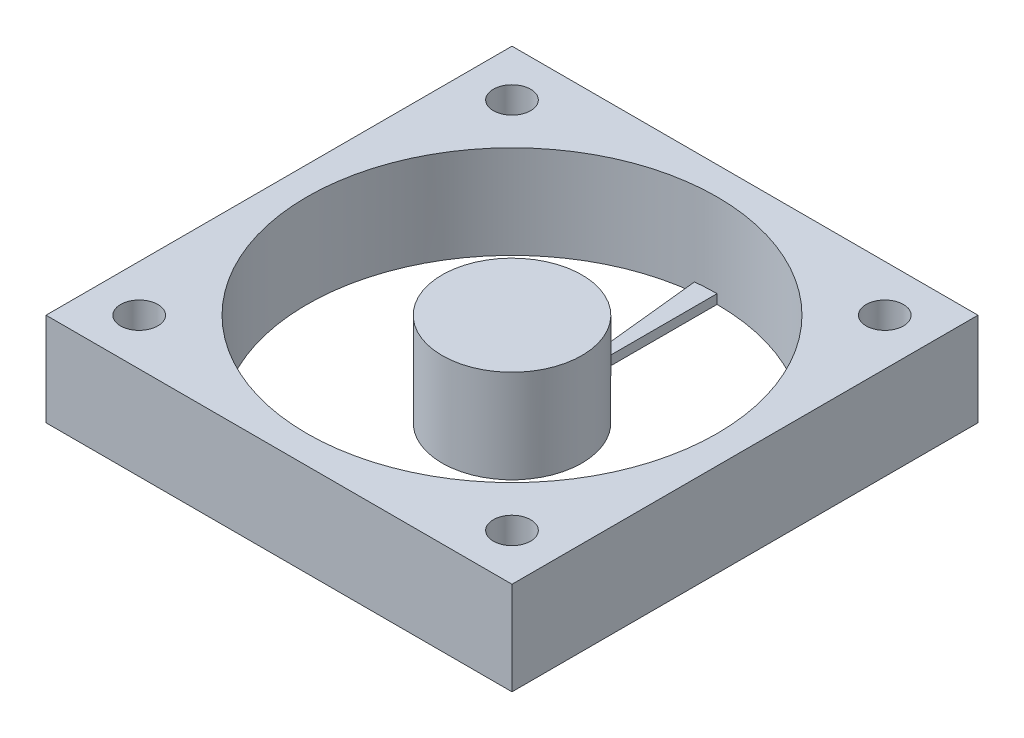
ISO-10303-21;
HEADER;
FILE_DESCRIPTION(('STEP AP214'),'2;1');
FILE_NAME('part.step','',(''),(''),'','','');
FILE_SCHEMA(('AUTOMOTIVE_DESIGN { 1 0 10303 214 1 1 1 1 }'));
ENDSEC;
DATA;
#1=APPLICATION_CONTEXT('core data for automotive mechanical design processes');
#2=APPLICATION_PROTOCOL_DEFINITION('international standard','automotive_design',2000,#1);
#3=PRODUCT_CONTEXT('',#1,'mechanical');
#4=PRODUCT('Part','Part','',(#3));
#5=PRODUCT_RELATED_PRODUCT_CATEGORY('part','',(#4));
#6=PRODUCT_DEFINITION_FORMATION('','',#4);
#7=PRODUCT_DEFINITION_CONTEXT('part definition',#1,'design');
#8=PRODUCT_DEFINITION('design','',#6,#7);
#9=PRODUCT_DEFINITION_SHAPE('','',#8);
#10=(LENGTH_UNIT() NAMED_UNIT(*) SI_UNIT(.MILLI.,.METRE.));
#11=(NAMED_UNIT(*) PLANE_ANGLE_UNIT() SI_UNIT($,.RADIAN.));
#12=(NAMED_UNIT(*) SI_UNIT($,.STERADIAN.) SOLID_ANGLE_UNIT());
#13=UNCERTAINTY_MEASURE_WITH_UNIT(LENGTH_MEASURE(1.E-05),#10,'distance_accuracy_value','');
#14=(GEOMETRIC_REPRESENTATION_CONTEXT(3) GLOBAL_UNCERTAINTY_ASSIGNED_CONTEXT((#13)) GLOBAL_UNIT_ASSIGNED_CONTEXT((#10,
#11,#12)) REPRESENTATION_CONTEXT('',''));
#15=CARTESIAN_POINT('',(0.,0.,0.));
#16=DIRECTION('',(0.,0.,1.));
#17=DIRECTION('',(1.,0.,0.));
#18=AXIS2_PLACEMENT_3D('',#15,#16,#17);
#19=CARTESIAN_POINT('',(0.,10.,0.));
#20=DIRECTION('',(0.,-1.,0.));
#21=DIRECTION('',(0.,0.,-1.));
#22=AXIS2_PLACEMENT_3D('',#19,#20,#21);
#23=PLANE('',#22);
#24=CARTESIAN_POINT('',(25.,10.,-25.));
#25=DIRECTION('',(0.,1.,0.));
#26=DIRECTION('',(0.,0.,1.));
#27=AXIS2_PLACEMENT_3D('',#24,#25,#26);
#28=CIRCLE('',#27,22.);
#29=CARTESIAN_POINT('',(25.,10.,-3.00000000000001));
#30=VERTEX_POINT('',#29);
#31=EDGE_CURVE('E136',#30,#30,#28,.T.);
#32=ORIENTED_EDGE('',*,*,#31,.F.);
#33=EDGE_LOOP('',(#32));
#34=FACE_BOUND('',#33,.T.);
#35=DIRECTION('',(0.,0.,1.));
#36=VECTOR('',#35,1.);
#37=CARTESIAN_POINT('',(0.,10.,0.));
#38=LINE('',#37,#36);
#39=CARTESIAN_POINT('',(0.,10.,-50.));
#40=VERTEX_POINT('',#39);
#41=CARTESIAN_POINT('',(0.,10.,0.));
#42=VERTEX_POINT('',#41);
#43=EDGE_CURVE('E169',#40,#42,#38,.T.);
#44=ORIENTED_EDGE('',*,*,#43,.T.);
#45=DIRECTION('',(1.,0.,0.));
#46=VECTOR('',#45,1.);
#47=CARTESIAN_POINT('',(0.,10.,0.));
#48=LINE('',#47,#46);
#49=CARTESIAN_POINT('',(50.,10.,0.));
#50=VERTEX_POINT('',#49);
#51=EDGE_CURVE('E172',#42,#50,#48,.T.);
#52=ORIENTED_EDGE('',*,*,#51,.T.);
#53=DIRECTION('',(0.,0.,-1.));
#54=VECTOR('',#53,1.);
#55=CARTESIAN_POINT('',(50.,10.,0.));
#56=LINE('',#55,#54);
#57=CARTESIAN_POINT('',(50.,10.,-50.));
#58=VERTEX_POINT('',#57);
#59=EDGE_CURVE('E175',#50,#58,#56,.T.);
#60=ORIENTED_EDGE('',*,*,#59,.T.);
#61=DIRECTION('',(-1.,0.,0.));
#62=VECTOR('',#61,1.);
#63=CARTESIAN_POINT('',(0.,10.,-50.));
#64=LINE('',#63,#62);
#65=EDGE_CURVE('E177',#58,#40,#64,.T.);
#66=ORIENTED_EDGE('',*,*,#65,.T.);
#67=EDGE_LOOP('',(#44,#52,#60,#66));
#68=FACE_BOUND('',#67,.T.);
#69=CARTESIAN_POINT('',(4.99999999999999,10.,-45.));
#70=DIRECTION('',(0.,1.,0.));
#71=DIRECTION('',(0.,0.,1.));
#72=AXIS2_PLACEMENT_3D('',#69,#70,#71);
#73=CIRCLE('',#72,2.);
#74=CARTESIAN_POINT('',(4.99999999999999,10.,-43.));
#75=VERTEX_POINT('',#74);
#76=EDGE_CURVE('E163',#75,#75,#73,.T.);
#77=ORIENTED_EDGE('',*,*,#76,.F.);
#78=EDGE_LOOP('',(#77));
#79=FACE_BOUND('',#78,.T.);
#80=CARTESIAN_POINT('',(45.,10.,-45.));
#81=DIRECTION('',(0.,1.,0.));
#82=DIRECTION('',(0.,0.,1.));
#83=AXIS2_PLACEMENT_3D('',#80,#81,#82);
#84=CIRCLE('',#83,2.);
#85=CARTESIAN_POINT('',(45.,10.,-43.));
#86=VERTEX_POINT('',#85);
#87=EDGE_CURVE('E157',#86,#86,#84,.T.);
#88=ORIENTED_EDGE('',*,*,#87,.F.);
#89=EDGE_LOOP('',(#88));
#90=FACE_BOUND('',#89,.T.);
#91=CARTESIAN_POINT('',(45.,10.,-5.));
#92=DIRECTION('',(0.,1.,0.));
#93=DIRECTION('',(0.,0.,1.));
#94=AXIS2_PLACEMENT_3D('',#91,#92,#93);
#95=CIRCLE('',#94,2.);
#96=CARTESIAN_POINT('',(45.,10.,-3.));
#97=VERTEX_POINT('',#96);
#98=EDGE_CURVE('E151',#97,#97,#95,.T.);
#99=ORIENTED_EDGE('',*,*,#98,.F.);
#100=EDGE_LOOP('',(#99));
#101=FACE_BOUND('',#100,.T.);
#102=CARTESIAN_POINT('',(4.99999999999999,10.,-5.));
#103=DIRECTION('',(0.,1.,0.));
#104=DIRECTION('',(0.,0.,1.));
#105=AXIS2_PLACEMENT_3D('',#102,#103,#104);
#106=CIRCLE('',#105,2.);
#107=CARTESIAN_POINT('',(4.99999999999999,10.,-3.));
#108=VERTEX_POINT('',#107);
#109=EDGE_CURVE('E145',#108,#108,#106,.T.);
#110=ORIENTED_EDGE('',*,*,#109,.F.);
#111=EDGE_LOOP('',(#110));
#112=FACE_BOUND('',#111,.T.);
#113=ADVANCED_FACE('F35',(#34,#68,#79,#90,#101,#112),#23,.F.);
#114=CARTESIAN_POINT('',(0.,0.,0.));
#115=DIRECTION('',(0.,-1.,0.));
#116=DIRECTION('',(0.,0.,-1.));
#117=AXIS2_PLACEMENT_3D('',#114,#115,#116);
#118=PLANE('',#117);
#119=CARTESIAN_POINT('',(25.,0.,-25.));
#120=DIRECTION('',(0.,-1.,0.));
#121=DIRECTION('',(0.,0.,-1.));
#122=AXIS2_PLACEMENT_3D('',#119,#120,#121);
#123=CIRCLE('',#122,7.5);
#124=CARTESIAN_POINT('',(25.,0.,-32.5));
#125=VERTEX_POINT('',#124);
#126=CARTESIAN_POINT('',(24.2160365254926,0.,-32.458914215262));
#127=VERTEX_POINT('',#126);
#128=EDGE_CURVE('E114',#125,#127,#123,.T.);
#129=ORIENTED_EDGE('',*,*,#128,.T.);
#130=DIRECTION('',(-0.104528463267654,0.,-0.994521895368273));
#131=VECTOR('',#130,1.);
#132=CARTESIAN_POINT('',(24.2160365254926,0.,-32.458914215262));
#133=LINE('',#132,#131);
#134=CARTESIAN_POINT('',(22.7003738081116,0.,-46.879481698102));
#135=VERTEX_POINT('',#134);
#136=EDGE_CURVE('E99',#127,#135,#133,.T.);
#137=ORIENTED_EDGE('',*,*,#136,.T.);
#138=CARTESIAN_POINT('',(25.,0.,-25.));
#139=DIRECTION('',(0.,-1.,0.));
#140=DIRECTION('',(0.,0.,-1.));
#141=AXIS2_PLACEMENT_3D('',#138,#139,#140);
#142=CIRCLE('',#141,22.);
#143=CARTESIAN_POINT('',(25.,0.,-47.));
#144=VERTEX_POINT('',#143);
#145=EDGE_CURVE('E127',#135,#144,#142,.F.);
#146=ORIENTED_EDGE('',*,*,#145,.T.);
#147=DIRECTION('',(0.,0.,1.));
#148=VECTOR('',#147,1.);
#149=CARTESIAN_POINT('',(25.,0.,-32.5));
#150=LINE('',#149,#148);
#151=EDGE_CURVE('E123',#144,#125,#150,.T.);
#152=ORIENTED_EDGE('',*,*,#151,.T.);
#153=EDGE_LOOP('',(#129,#137,#146,#152));
#154=FACE_BOUND('',#153,.T.);
#155=CARTESIAN_POINT('',(45.,0.,-5.));
#156=DIRECTION('',(0.,1.,0.));
#157=DIRECTION('',(0.,0.,1.));
#158=AXIS2_PLACEMENT_3D('',#155,#156,#157);
#159=CIRCLE('',#158,2.);
#160=CARTESIAN_POINT('',(45.,0.,-3.));
#161=VERTEX_POINT('',#160);
#162=EDGE_CURVE('E148',#161,#161,#159,.T.);
#163=ORIENTED_EDGE('',*,*,#162,.T.);
#164=EDGE_LOOP('',(#163));
#165=FACE_BOUND('',#164,.T.);
#166=CARTESIAN_POINT('',(4.99999999999999,0.,-45.));
#167=DIRECTION('',(0.,1.,0.));
#168=DIRECTION('',(0.,0.,1.));
#169=AXIS2_PLACEMENT_3D('',#166,#167,#168);
#170=CIRCLE('',#169,2.);
#171=CARTESIAN_POINT('',(4.99999999999999,0.,-43.));
#172=VERTEX_POINT('',#171);
#173=EDGE_CURVE('E160',#172,#172,#170,.T.);
#174=ORIENTED_EDGE('',*,*,#173,.T.);
#175=EDGE_LOOP('',(#174));
#176=FACE_BOUND('',#175,.T.);
#177=DIRECTION('',(0.,0.,1.));
#178=VECTOR('',#177,1.);
#179=CARTESIAN_POINT('',(0.,0.,0.));
#180=LINE('',#179,#178);
#181=CARTESIAN_POINT('',(0.,0.,-50.));
#182=VERTEX_POINT('',#181);
#183=CARTESIAN_POINT('',(0.,0.,0.));
#184=VERTEX_POINT('',#183);
#185=EDGE_CURVE('E166',#182,#184,#180,.T.);
#186=ORIENTED_EDGE('',*,*,#185,.F.);
#187=DIRECTION('',(-1.,0.,0.));
#188=VECTOR('',#187,1.);
#189=CARTESIAN_POINT('',(0.,0.,-50.));
#190=LINE('',#189,#188);
#191=CARTESIAN_POINT('',(50.,0.,-50.));
#192=VERTEX_POINT('',#191);
#193=EDGE_CURVE('E173',#192,#182,#190,.T.);
#194=ORIENTED_EDGE('',*,*,#193,.F.);
#195=DIRECTION('',(0.,0.,-1.));
#196=VECTOR('',#195,1.);
#197=CARTESIAN_POINT('',(50.,0.,0.));
#198=LINE('',#197,#196);
#199=CARTESIAN_POINT('',(50.,0.,0.));
#200=VERTEX_POINT('',#199);
#201=EDGE_CURVE('E184',#200,#192,#198,.T.);
#202=ORIENTED_EDGE('',*,*,#201,.F.);
#203=DIRECTION('',(1.,0.,0.));
#204=VECTOR('',#203,1.);
#205=CARTESIAN_POINT('',(0.,0.,0.));
#206=LINE('',#205,#204);
#207=EDGE_CURVE('E182',#184,#200,#206,.T.);
#208=ORIENTED_EDGE('',*,*,#207,.F.);
#209=EDGE_LOOP('',(#186,#194,#202,#208));
#210=FACE_BOUND('',#209,.T.);
#211=CARTESIAN_POINT('',(45.,0.,-45.));
#212=DIRECTION('',(0.,1.,0.));
#213=DIRECTION('',(0.,0.,1.));
#214=AXIS2_PLACEMENT_3D('',#211,#212,#213);
#215=CIRCLE('',#214,2.);
#216=CARTESIAN_POINT('',(45.,0.,-43.));
#217=VERTEX_POINT('',#216);
#218=EDGE_CURVE('E154',#217,#217,#215,.T.);
#219=ORIENTED_EDGE('',*,*,#218,.T.);
#220=EDGE_LOOP('',(#219));
#221=FACE_BOUND('',#220,.T.);
#222=CARTESIAN_POINT('',(4.99999999999999,0.,-5.));
#223=DIRECTION('',(0.,1.,0.));
#224=DIRECTION('',(0.,0.,1.));
#225=AXIS2_PLACEMENT_3D('',#222,#223,#224);
#226=CIRCLE('',#225,2.);
#227=CARTESIAN_POINT('',(4.99999999999999,0.,-3.));
#228=VERTEX_POINT('',#227);
#229=EDGE_CURVE('E142',#228,#228,#226,.T.);
#230=ORIENTED_EDGE('',*,*,#229,.T.);
#231=EDGE_LOOP('',(#230));
#232=FACE_BOUND('',#231,.T.);
#233=ADVANCED_FACE('F121',(#154,#165,#176,#210,#221,#232),#118,.T.);
#234=CARTESIAN_POINT('',(0.,10.,0.));
#235=DIRECTION('',(1.,0.,0.));
#236=DIRECTION('',(0.,0.,-1.));
#237=AXIS2_PLACEMENT_3D('',#234,#235,#236);
#238=PLANE('',#237);
#239=ORIENTED_EDGE('',*,*,#185,.T.);
#240=DIRECTION('',(0.,-1.,0.));
#241=VECTOR('',#240,1.);
#242=CARTESIAN_POINT('',(0.,10.,0.));
#243=LINE('',#242,#241);
#244=EDGE_CURVE('E11',#42,#184,#243,.T.);
#245=ORIENTED_EDGE('',*,*,#244,.F.);
#246=ORIENTED_EDGE('',*,*,#43,.F.);
#247=DIRECTION('',(0.,-1.,0.));
#248=VECTOR('',#247,1.);
#249=CARTESIAN_POINT('',(0.,10.,-50.));
#250=LINE('',#249,#248);
#251=EDGE_CURVE('E179',#40,#182,#250,.T.);
#252=ORIENTED_EDGE('',*,*,#251,.T.);
#253=EDGE_LOOP('',(#239,#245,#246,#252));
#254=FACE_BOUND('',#253,.T.);
#255=ADVANCED_FACE('F37',(#254),#238,.F.);
#256=CARTESIAN_POINT('',(0.,10.,0.));
#257=DIRECTION('',(0.,0.,-1.));
#258=DIRECTION('',(-1.,0.,0.));
#259=AXIS2_PLACEMENT_3D('',#256,#257,#258);
#260=PLANE('',#259);
#261=ORIENTED_EDGE('',*,*,#207,.T.);
#262=DIRECTION('',(0.,-1.,0.));
#263=VECTOR('',#262,1.);
#264=CARTESIAN_POINT('',(50.,10.,0.));
#265=LINE('',#264,#263);
#266=EDGE_CURVE('E43',#50,#200,#265,.T.);
#267=ORIENTED_EDGE('',*,*,#266,.F.);
#268=ORIENTED_EDGE('',*,*,#51,.F.);
#269=ORIENTED_EDGE('',*,*,#244,.T.);
#270=EDGE_LOOP('',(#261,#267,#268,#269));
#271=FACE_BOUND('',#270,.T.);
#272=ADVANCED_FACE('F212',(#271),#260,.F.);
#273=CARTESIAN_POINT('',(50.,10.,0.));
#274=DIRECTION('',(-1.,0.,0.));
#275=DIRECTION('',(0.,0.,1.));
#276=AXIS2_PLACEMENT_3D('',#273,#274,#275);
#277=PLANE('',#276);
#278=ORIENTED_EDGE('',*,*,#201,.T.);
#279=DIRECTION('',(0.,-1.,0.));
#280=VECTOR('',#279,1.);
#281=CARTESIAN_POINT('',(50.,10.,-50.));
#282=LINE('',#281,#280);
#283=EDGE_CURVE('E189',#58,#192,#282,.T.);
#284=ORIENTED_EDGE('',*,*,#283,.F.);
#285=ORIENTED_EDGE('',*,*,#59,.F.);
#286=ORIENTED_EDGE('',*,*,#266,.T.);
#287=EDGE_LOOP('',(#278,#284,#285,#286));
#288=FACE_BOUND('',#287,.T.);
#289=ADVANCED_FACE('F196',(#288),#277,.F.);
#290=CARTESIAN_POINT('',(0.,10.,-50.));
#291=DIRECTION('',(0.,0.,1.));
#292=DIRECTION('',(1.,0.,0.));
#293=AXIS2_PLACEMENT_3D('',#290,#291,#292);
#294=PLANE('',#293);
#295=ORIENTED_EDGE('',*,*,#193,.T.);
#296=ORIENTED_EDGE('',*,*,#251,.F.);
#297=ORIENTED_EDGE('',*,*,#65,.F.);
#298=ORIENTED_EDGE('',*,*,#283,.T.);
#299=EDGE_LOOP('',(#295,#296,#297,#298));
#300=FACE_BOUND('',#299,.T.);
#301=ADVANCED_FACE('F205',(#300),#294,.F.);
#302=CARTESIAN_POINT('',(4.99999999999999,10.,-45.));
#303=DIRECTION('',(0.,-1.,0.));
#304=DIRECTION('',(0.,0.,-1.));
#305=AXIS2_PLACEMENT_3D('',#302,#303,#304);
#306=CYLINDRICAL_SURFACE('',#305,2.);
#307=ORIENTED_EDGE('',*,*,#76,.T.);
#308=EDGE_LOOP('',(#307));
#309=FACE_BOUND('',#308,.T.);
#310=ORIENTED_EDGE('',*,*,#173,.F.);
#311=EDGE_LOOP('',(#310));
#312=FACE_BOUND('',#311,.T.);
#313=ADVANCED_FACE('F261',(#309,#312),#306,.F.);
#314=CARTESIAN_POINT('',(45.,10.,-45.));
#315=DIRECTION('',(0.,-1.,0.));
#316=DIRECTION('',(0.,0.,-1.));
#317=AXIS2_PLACEMENT_3D('',#314,#315,#316);
#318=CYLINDRICAL_SURFACE('',#317,2.);
#319=ORIENTED_EDGE('',*,*,#87,.T.);
#320=EDGE_LOOP('',(#319));
#321=FACE_BOUND('',#320,.T.);
#322=ORIENTED_EDGE('',*,*,#218,.F.);
#323=EDGE_LOOP('',(#322));
#324=FACE_BOUND('',#323,.T.);
#325=ADVANCED_FACE('F258',(#321,#324),#318,.F.);
#326=CARTESIAN_POINT('',(45.,10.,-5.));
#327=DIRECTION('',(0.,-1.,0.));
#328=DIRECTION('',(0.,0.,-1.));
#329=AXIS2_PLACEMENT_3D('',#326,#327,#328);
#330=CYLINDRICAL_SURFACE('',#329,2.);
#331=ORIENTED_EDGE('',*,*,#98,.T.);
#332=EDGE_LOOP('',(#331));
#333=FACE_BOUND('',#332,.T.);
#334=ORIENTED_EDGE('',*,*,#162,.F.);
#335=EDGE_LOOP('',(#334));
#336=FACE_BOUND('',#335,.T.);
#337=ADVANCED_FACE('F254',(#333,#336),#330,.F.);
#338=CARTESIAN_POINT('',(4.99999999999999,10.,-5.));
#339=DIRECTION('',(0.,-1.,0.));
#340=DIRECTION('',(0.,0.,-1.));
#341=AXIS2_PLACEMENT_3D('',#338,#339,#340);
#342=CYLINDRICAL_SURFACE('',#341,2.);
#343=ORIENTED_EDGE('',*,*,#109,.T.);
#344=EDGE_LOOP('',(#343));
#345=FACE_BOUND('',#344,.T.);
#346=ORIENTED_EDGE('',*,*,#229,.F.);
#347=EDGE_LOOP('',(#346));
#348=FACE_BOUND('',#347,.T.);
#349=ADVANCED_FACE('F250',(#345,#348),#342,.F.);
#350=CARTESIAN_POINT('',(25.,1.,-25.));
#351=DIRECTION('',(0.,1.,0.));
#352=DIRECTION('',(0.,0.,1.));
#353=AXIS2_PLACEMENT_3D('',#350,#351,#352);
#354=CYLINDRICAL_SURFACE('',#353,22.);
#355=CARTESIAN_POINT('',(25.,1.,-25.));
#356=DIRECTION('',(0.,1.,0.));
#357=DIRECTION('',(0.,0.,1.));
#358=AXIS2_PLACEMENT_3D('',#355,#356,#357);
#359=CIRCLE('',#358,22.);
#360=CARTESIAN_POINT('',(25.,1.,-47.));
#361=VERTEX_POINT('',#360);
#362=CARTESIAN_POINT('',(22.7003738081116,1.,-46.879481698102));
#363=VERTEX_POINT('',#362);
#364=EDGE_CURVE('E139',#361,#363,#359,.T.);
#365=ORIENTED_EDGE('',*,*,#364,.F.);
#366=DIRECTION('',(0.,1.,0.));
#367=VECTOR('',#366,1.);
#368=CARTESIAN_POINT('',(25.,-0.000999999999999916,-47.));
#369=LINE('',#368,#367);
#370=EDGE_CURVE('E50',#144,#361,#369,.T.);
#371=ORIENTED_EDGE('',*,*,#370,.F.);
#372=ORIENTED_EDGE('',*,*,#145,.F.);
#373=DIRECTION('',(0.,1.,0.));
#374=VECTOR('',#373,1.);
#375=CARTESIAN_POINT('',(22.7003738081116,-0.000999999999999916,-46.879481698102));
#376=LINE('',#375,#374);
#377=EDGE_CURVE('E58',#135,#363,#376,.T.);
#378=ORIENTED_EDGE('',*,*,#377,.T.);
#379=EDGE_LOOP('',(#365,#371,#372,#378));
#380=FACE_BOUND('',#379,.T.);
#381=ORIENTED_EDGE('',*,*,#31,.T.);
#382=EDGE_LOOP('',(#381));
#383=FACE_BOUND('',#382,.T.);
#384=ADVANCED_FACE('F243',(#380,#383),#354,.F.);
#385=CARTESIAN_POINT('',(25.,1.,-25.));
#386=DIRECTION('',(0.,1.,0.));
#387=DIRECTION('',(0.,0.,1.));
#388=AXIS2_PLACEMENT_3D('',#385,#386,#387);
#389=PLANE('',#388);
#390=DIRECTION('',(-0.104528463267654,0.,-0.994521895368273));
#391=VECTOR('',#390,1.);
#392=CARTESIAN_POINT('',(24.2160365254926,1.,-32.458914215262));
#393=LINE('',#392,#391);
#394=CARTESIAN_POINT('',(24.2160365254926,1.,-32.458914215262));
#395=VERTEX_POINT('',#394);
#396=EDGE_CURVE('E124',#395,#363,#393,.T.);
#397=ORIENTED_EDGE('',*,*,#396,.F.);
#398=CARTESIAN_POINT('',(25.,1.,-25.));
#399=DIRECTION('',(0.,1.,0.));
#400=DIRECTION('',(0.,0.,1.));
#401=AXIS2_PLACEMENT_3D('',#398,#399,#400);
#402=CIRCLE('',#401,7.5);
#403=CARTESIAN_POINT('',(25.,1.,-32.5));
#404=VERTEX_POINT('',#403);
#405=EDGE_CURVE('E117',#404,#395,#402,.T.);
#406=ORIENTED_EDGE('',*,*,#405,.F.);
#407=DIRECTION('',(0.,0.,1.));
#408=VECTOR('',#407,1.);
#409=CARTESIAN_POINT('',(25.,1.,-32.5));
#410=LINE('',#409,#408);
#411=EDGE_CURVE('E118',#361,#404,#410,.T.);
#412=ORIENTED_EDGE('',*,*,#411,.F.);
#413=ORIENTED_EDGE('',*,*,#364,.T.);
#414=EDGE_LOOP('',(#397,#406,#412,#413));
#415=FACE_BOUND('',#414,.T.);
#416=ADVANCED_FACE('F237',(#415),#389,.T.);
#417=CARTESIAN_POINT('',(25.,1.,-25.));
#418=DIRECTION('',(0.,1.,0.));
#419=DIRECTION('',(0.,0.,1.));
#420=AXIS2_PLACEMENT_3D('',#417,#418,#419);
#421=CYLINDRICAL_SURFACE('',#420,7.5);
#422=ORIENTED_EDGE('',*,*,#405,.T.);
#423=DIRECTION('',(0.,1.,0.));
#424=VECTOR('',#423,1.);
#425=CARTESIAN_POINT('',(24.2160365254926,-0.000999999999999916,-32.458914215262));
#426=LINE('',#425,#424);
#427=EDGE_CURVE('E102',#127,#395,#426,.T.);
#428=ORIENTED_EDGE('',*,*,#427,.F.);
#429=ORIENTED_EDGE('',*,*,#128,.F.);
#430=DIRECTION('',(0.,1.,0.));
#431=VECTOR('',#430,1.);
#432=CARTESIAN_POINT('',(25.,-0.000999999999999916,-32.5));
#433=LINE('',#432,#431);
#434=EDGE_CURVE('E108',#125,#404,#433,.T.);
#435=ORIENTED_EDGE('',*,*,#434,.T.);
#436=EDGE_LOOP('',(#422,#428,#429,#435));
#437=FACE_BOUND('',#436,.T.);
#438=CARTESIAN_POINT('',(25.,10.,-25.));
#439=DIRECTION('',(0.,1.,0.));
#440=DIRECTION('',(0.,0.,1.));
#441=AXIS2_PLACEMENT_3D('',#438,#439,#440);
#442=CIRCLE('',#441,7.5);
#443=CARTESIAN_POINT('',(25.,10.,-17.5));
#444=VERTEX_POINT('',#443);
#445=EDGE_CURVE('E107',#444,#444,#442,.T.);
#446=ORIENTED_EDGE('',*,*,#445,.F.);
#447=EDGE_LOOP('',(#446));
#448=FACE_BOUND('',#447,.T.);
#449=ADVANCED_FACE('F112',(#437,#448),#421,.T.);
#450=ORIENTED_EDGE('',*,*,#445,.T.);
#451=EDGE_LOOP('',(#450));
#452=FACE_BOUND('',#451,.T.);
#453=ADVANCED_FACE('F222',(#452),#23,.F.);
#454=CARTESIAN_POINT('',(25.,-0.000999999999999916,-32.5));
#455=DIRECTION('',(-1.,0.,0.));
#456=DIRECTION('',(0.,0.,1.));
#457=AXIS2_PLACEMENT_3D('',#454,#455,#456);
#458=PLANE('',#457);
#459=ORIENTED_EDGE('',*,*,#370,.T.);
#460=ORIENTED_EDGE('',*,*,#411,.T.);
#461=ORIENTED_EDGE('',*,*,#434,.F.);
#462=ORIENTED_EDGE('',*,*,#151,.F.);
#463=EDGE_LOOP('',(#459,#460,#461,#462));
#464=FACE_BOUND('',#463,.T.);
#465=ADVANCED_FACE('F230',(#464),#458,.F.);
#466=CARTESIAN_POINT('',(24.2160365254926,-0.000999999999999916,-32.458914215262));
#467=DIRECTION('',(0.994521895368273,0.,-0.104528463267654));
#468=DIRECTION('',(-0.104528463267654,0.,-0.994521895368273));
#469=AXIS2_PLACEMENT_3D('',#466,#467,#468);
#470=PLANE('',#469);
#471=ORIENTED_EDGE('',*,*,#427,.T.);
#472=ORIENTED_EDGE('',*,*,#396,.T.);
#473=ORIENTED_EDGE('',*,*,#377,.F.);
#474=ORIENTED_EDGE('',*,*,#136,.F.);
#475=EDGE_LOOP('',(#471,#472,#473,#474));
#476=FACE_BOUND('',#475,.T.);
#477=ADVANCED_FACE('F101',(#476),#470,.F.);
#478=CLOSED_SHELL('',(#113,#233,#255,#272,#289,#301,#313,#325,#337,#349,#384,#416,#449,#453,
#465,#477));
#479=MANIFOLD_SOLID_BREP('B2',#478);
#480=ADVANCED_BREP_SHAPE_REPRESENTATION('',(#18,#479),#14);
#481=SHAPE_DEFINITION_REPRESENTATION(#9,#480);
ENDSEC;
END-ISO-10303-21;
